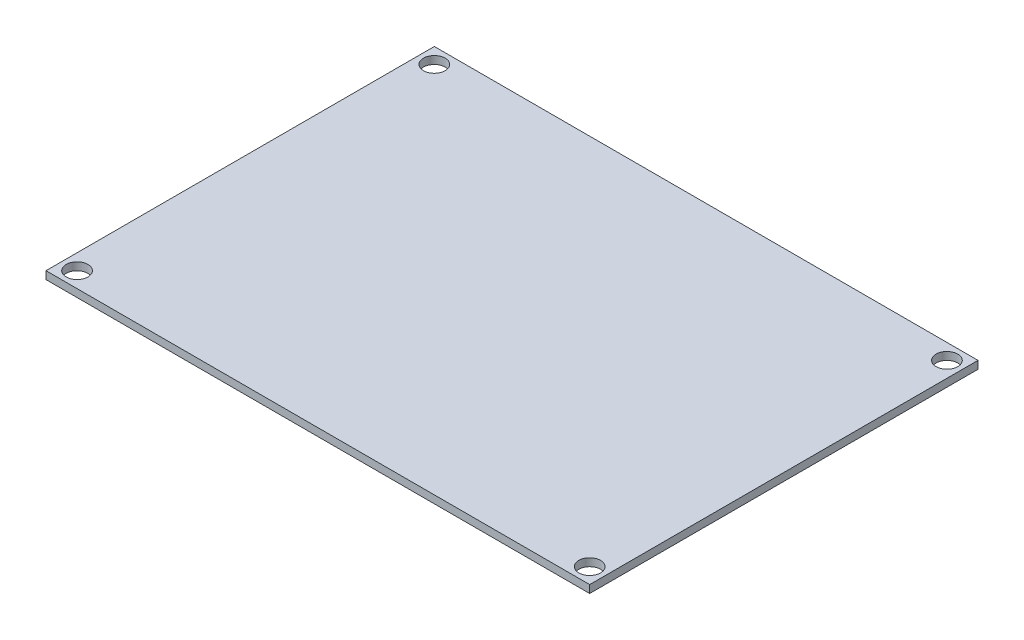
ISO-10303-21;
HEADER;
FILE_DESCRIPTION(('STEP AP214'),'2;1');
FILE_NAME('part.step','',(''),(''),'','','');
FILE_SCHEMA(('AUTOMOTIVE_DESIGN { 1 0 10303 214 1 1 1 1 }'));
ENDSEC;
DATA;
#1=APPLICATION_CONTEXT('core data for automotive mechanical design processes');
#2=APPLICATION_PROTOCOL_DEFINITION('international standard','automotive_design',2000,#1);
#3=PRODUCT_CONTEXT('',#1,'mechanical');
#4=PRODUCT('Part','Part','',(#3));
#5=PRODUCT_RELATED_PRODUCT_CATEGORY('part','',(#4));
#6=PRODUCT_DEFINITION_FORMATION('','',#4);
#7=PRODUCT_DEFINITION_CONTEXT('part definition',#1,'design');
#8=PRODUCT_DEFINITION('design','',#6,#7);
#9=PRODUCT_DEFINITION_SHAPE('','',#8);
#10=(LENGTH_UNIT() NAMED_UNIT(*) SI_UNIT(.MILLI.,.METRE.));
#11=(NAMED_UNIT(*) PLANE_ANGLE_UNIT() SI_UNIT($,.RADIAN.));
#12=(NAMED_UNIT(*) SI_UNIT($,.STERADIAN.) SOLID_ANGLE_UNIT());
#13=UNCERTAINTY_MEASURE_WITH_UNIT(LENGTH_MEASURE(1.E-05),#10,'distance_accuracy_value','');
#14=(GEOMETRIC_REPRESENTATION_CONTEXT(3) GLOBAL_UNCERTAINTY_ASSIGNED_CONTEXT((#13)) GLOBAL_UNIT_ASSIGNED_CONTEXT((#10,
#11,#12)) REPRESENTATION_CONTEXT('',''));
#15=CARTESIAN_POINT('',(0.,0.,0.));
#16=DIRECTION('',(0.,0.,1.));
#17=DIRECTION('',(1.,0.,0.));
#18=AXIS2_PLACEMENT_3D('',#15,#16,#17);
#19=CARTESIAN_POINT('',(0.,1.,0.));
#20=DIRECTION('',(1.,0.,0.));
#21=DIRECTION('',(0.,0.,-1.));
#22=AXIS2_PLACEMENT_3D('',#19,#20,#21);
#23=PLANE('',#22);
#24=DIRECTION('',(0.,0.,1.));
#25=VECTOR('',#24,1.);
#26=CARTESIAN_POINT('',(0.,0.,0.));
#27=LINE('',#26,#25);
#28=CARTESIAN_POINT('',(0.,0.,-50.));
#29=VERTEX_POINT('',#28);
#30=CARTESIAN_POINT('',(0.,0.,0.));
#31=VERTEX_POINT('',#30);
#32=EDGE_CURVE('E96',#29,#31,#27,.T.);
#33=ORIENTED_EDGE('',*,*,#32,.T.);
#34=DIRECTION('',(0.,-1.,0.));
#35=VECTOR('',#34,1.);
#36=CARTESIAN_POINT('',(0.,1.,0.));
#37=LINE('',#36,#35);
#38=CARTESIAN_POINT('',(0.,1.,0.));
#39=VERTEX_POINT('',#38);
#40=EDGE_CURVE('E11',#39,#31,#37,.T.);
#41=ORIENTED_EDGE('',*,*,#40,.F.);
#42=DIRECTION('',(0.,0.,1.));
#43=VECTOR('',#42,1.);
#44=CARTESIAN_POINT('',(0.,1.,0.));
#45=LINE('',#44,#43);
#46=CARTESIAN_POINT('',(0.,1.,-50.));
#47=VERTEX_POINT('',#46);
#48=EDGE_CURVE('E84',#47,#39,#45,.T.);
#49=ORIENTED_EDGE('',*,*,#48,.F.);
#50=DIRECTION('',(0.,-1.,0.));
#51=VECTOR('',#50,1.);
#52=CARTESIAN_POINT('',(0.,1.,-50.));
#53=LINE('',#52,#51);
#54=EDGE_CURVE('E92',#47,#29,#53,.T.);
#55=ORIENTED_EDGE('',*,*,#54,.T.);
#56=EDGE_LOOP('',(#33,#41,#49,#55));
#57=FACE_BOUND('',#56,.T.);
#58=ADVANCED_FACE('F33',(#57),#23,.F.);
#59=CARTESIAN_POINT('',(0.,1.,0.));
#60=DIRECTION('',(0.,0.,-1.));
#61=DIRECTION('',(-1.,0.,0.));
#62=AXIS2_PLACEMENT_3D('',#59,#60,#61);
#63=PLANE('',#62);
#64=DIRECTION('',(1.,0.,0.));
#65=VECTOR('',#64,1.);
#66=CARTESIAN_POINT('',(0.,0.,0.));
#67=LINE('',#66,#65);
#68=CARTESIAN_POINT('',(70.,0.,0.));
#69=VERTEX_POINT('',#68);
#70=EDGE_CURVE('E88',#31,#69,#67,.T.);
#71=ORIENTED_EDGE('',*,*,#70,.T.);
#72=DIRECTION('',(0.,-1.,0.));
#73=VECTOR('',#72,1.);
#74=CARTESIAN_POINT('',(70.,1.,0.));
#75=LINE('',#74,#73);
#76=CARTESIAN_POINT('',(70.,1.,0.));
#77=VERTEX_POINT('',#76);
#78=EDGE_CURVE('E41',#77,#69,#75,.T.);
#79=ORIENTED_EDGE('',*,*,#78,.F.);
#80=DIRECTION('',(1.,0.,0.));
#81=VECTOR('',#80,1.);
#82=CARTESIAN_POINT('',(0.,1.,0.));
#83=LINE('',#82,#81);
#84=EDGE_CURVE('E79',#39,#77,#83,.T.);
#85=ORIENTED_EDGE('',*,*,#84,.F.);
#86=ORIENTED_EDGE('',*,*,#40,.T.);
#87=EDGE_LOOP('',(#71,#79,#85,#86));
#88=FACE_BOUND('',#87,.T.);
#89=ADVANCED_FACE('F87',(#88),#63,.F.);
#90=CARTESIAN_POINT('',(70.,1.,0.));
#91=DIRECTION('',(-1.,0.,0.));
#92=DIRECTION('',(0.,0.,1.));
#93=AXIS2_PLACEMENT_3D('',#90,#91,#92);
#94=PLANE('',#93);
#95=DIRECTION('',(0.,0.,-1.));
#96=VECTOR('',#95,1.);
#97=CARTESIAN_POINT('',(70.,0.,0.));
#98=LINE('',#97,#96);
#99=CARTESIAN_POINT('',(70.,0.,-50.));
#100=VERTEX_POINT('',#99);
#101=EDGE_CURVE('E66',#69,#100,#98,.T.);
#102=ORIENTED_EDGE('',*,*,#101,.T.);
#103=DIRECTION('',(0.,-1.,0.));
#104=VECTOR('',#103,1.);
#105=CARTESIAN_POINT('',(70.,1.,-50.));
#106=LINE('',#105,#104);
#107=CARTESIAN_POINT('',(70.,1.,-50.));
#108=VERTEX_POINT('',#107);
#109=EDGE_CURVE('E89',#108,#100,#106,.T.);
#110=ORIENTED_EDGE('',*,*,#109,.F.);
#111=DIRECTION('',(0.,0.,-1.));
#112=VECTOR('',#111,1.);
#113=CARTESIAN_POINT('',(70.,1.,0.));
#114=LINE('',#113,#112);
#115=EDGE_CURVE('E82',#77,#108,#114,.T.);
#116=ORIENTED_EDGE('',*,*,#115,.F.);
#117=ORIENTED_EDGE('',*,*,#78,.T.);
#118=EDGE_LOOP('',(#102,#110,#116,#117));
#119=FACE_BOUND('',#118,.T.);
#120=ADVANCED_FACE('F90',(#119),#94,.F.);
#121=CARTESIAN_POINT('',(0.,1.,-50.));
#122=DIRECTION('',(0.,0.,1.));
#123=DIRECTION('',(1.,0.,0.));
#124=AXIS2_PLACEMENT_3D('',#121,#122,#123);
#125=PLANE('',#124);
#126=DIRECTION('',(-1.,0.,0.));
#127=VECTOR('',#126,1.);
#128=CARTESIAN_POINT('',(0.,0.,-50.));
#129=LINE('',#128,#127);
#130=EDGE_CURVE('E72',#100,#29,#129,.T.);
#131=ORIENTED_EDGE('',*,*,#130,.T.);
#132=ORIENTED_EDGE('',*,*,#54,.F.);
#133=DIRECTION('',(-1.,0.,0.));
#134=VECTOR('',#133,1.);
#135=CARTESIAN_POINT('',(0.,1.,-50.));
#136=LINE('',#135,#134);
#137=EDGE_CURVE('E49',#108,#47,#136,.T.);
#138=ORIENTED_EDGE('',*,*,#137,.F.);
#139=ORIENTED_EDGE('',*,*,#109,.T.);
#140=EDGE_LOOP('',(#131,#132,#138,#139));
#141=FACE_BOUND('',#140,.T.);
#142=ADVANCED_FACE('F104',(#141),#125,.F.);
#143=CARTESIAN_POINT('',(0.,1.,0.));
#144=DIRECTION('',(0.,-1.,0.));
#145=DIRECTION('',(0.,0.,-1.));
#146=AXIS2_PLACEMENT_3D('',#143,#144,#145);
#147=PLANE('',#146);
#148=CARTESIAN_POINT('',(2.00000000000001,1.,-2.00000000000001));
#149=DIRECTION('',(0.,1.,0.));
#150=DIRECTION('',(0.,0.,1.));
#151=AXIS2_PLACEMENT_3D('',#148,#149,#150);
#152=CIRCLE('',#151,1.4);
#153=CARTESIAN_POINT('',(2.00000000000001,1.,-0.600000000000009));
#154=VERTEX_POINT('',#153);
#155=EDGE_CURVE('E116',#154,#154,#152,.T.);
#156=ORIENTED_EDGE('',*,*,#155,.F.);
#157=EDGE_LOOP('',(#156));
#158=FACE_BOUND('',#157,.T.);
#159=CARTESIAN_POINT('',(68.,1.,-2.00000000000001));
#160=DIRECTION('',(0.,1.,0.));
#161=DIRECTION('',(0.,0.,1.));
#162=AXIS2_PLACEMENT_3D('',#159,#160,#161);
#163=CIRCLE('',#162,1.4);
#164=CARTESIAN_POINT('',(68.,1.,-0.600000000000006));
#165=VERTEX_POINT('',#164);
#166=EDGE_CURVE('E122',#165,#165,#163,.T.);
#167=ORIENTED_EDGE('',*,*,#166,.F.);
#168=EDGE_LOOP('',(#167));
#169=FACE_BOUND('',#168,.T.);
#170=CARTESIAN_POINT('',(68.,1.,-48.));
#171=DIRECTION('',(0.,1.,0.));
#172=DIRECTION('',(0.,0.,1.));
#173=AXIS2_PLACEMENT_3D('',#170,#171,#172);
#174=CIRCLE('',#173,1.4);
#175=CARTESIAN_POINT('',(68.,1.,-46.6));
#176=VERTEX_POINT('',#175);
#177=EDGE_CURVE('E128',#176,#176,#174,.T.);
#178=ORIENTED_EDGE('',*,*,#177,.F.);
#179=EDGE_LOOP('',(#178));
#180=FACE_BOUND('',#179,.T.);
#181=CARTESIAN_POINT('',(2.00000000000002,1.,-48.));
#182=DIRECTION('',(0.,1.,0.));
#183=DIRECTION('',(0.,0.,1.));
#184=AXIS2_PLACEMENT_3D('',#181,#182,#183);
#185=CIRCLE('',#184,1.4);
#186=CARTESIAN_POINT('',(2.00000000000002,1.,-46.6));
#187=VERTEX_POINT('',#186);
#188=EDGE_CURVE('E110',#187,#187,#185,.T.);
#189=ORIENTED_EDGE('',*,*,#188,.F.);
#190=EDGE_LOOP('',(#189));
#191=FACE_BOUND('',#190,.T.);
#192=ORIENTED_EDGE('',*,*,#48,.T.);
#193=ORIENTED_EDGE('',*,*,#84,.T.);
#194=ORIENTED_EDGE('',*,*,#115,.T.);
#195=ORIENTED_EDGE('',*,*,#137,.T.);
#196=EDGE_LOOP('',(#192,#193,#194,#195));
#197=FACE_BOUND('',#196,.T.);
#198=ADVANCED_FACE('F80',(#158,#169,#180,#191,#197),#147,.F.);
#199=CARTESIAN_POINT('',(0.,0.,0.));
#200=DIRECTION('',(0.,-1.,0.));
#201=DIRECTION('',(0.,0.,-1.));
#202=AXIS2_PLACEMENT_3D('',#199,#200,#201);
#203=PLANE('',#202);
#204=CARTESIAN_POINT('',(2.00000000000001,0.,-2.00000000000001));
#205=DIRECTION('',(0.,1.,0.));
#206=DIRECTION('',(0.,0.,1.));
#207=AXIS2_PLACEMENT_3D('',#204,#205,#206);
#208=CIRCLE('',#207,1.4);
#209=CARTESIAN_POINT('',(2.00000000000001,0.,-0.600000000000009));
#210=VERTEX_POINT('',#209);
#211=EDGE_CURVE('E119',#210,#210,#208,.T.);
#212=ORIENTED_EDGE('',*,*,#211,.T.);
#213=EDGE_LOOP('',(#212));
#214=FACE_BOUND('',#213,.T.);
#215=CARTESIAN_POINT('',(68.,0.,-2.00000000000001));
#216=DIRECTION('',(0.,1.,0.));
#217=DIRECTION('',(0.,0.,1.));
#218=AXIS2_PLACEMENT_3D('',#215,#216,#217);
#219=CIRCLE('',#218,1.4);
#220=CARTESIAN_POINT('',(68.,0.,-0.600000000000006));
#221=VERTEX_POINT('',#220);
#222=EDGE_CURVE('E125',#221,#221,#219,.T.);
#223=ORIENTED_EDGE('',*,*,#222,.T.);
#224=EDGE_LOOP('',(#223));
#225=FACE_BOUND('',#224,.T.);
#226=CARTESIAN_POINT('',(68.,0.,-48.));
#227=DIRECTION('',(0.,1.,0.));
#228=DIRECTION('',(0.,0.,1.));
#229=AXIS2_PLACEMENT_3D('',#226,#227,#228);
#230=CIRCLE('',#229,1.4);
#231=CARTESIAN_POINT('',(68.,0.,-46.6));
#232=VERTEX_POINT('',#231);
#233=EDGE_CURVE('E113',#232,#232,#230,.T.);
#234=ORIENTED_EDGE('',*,*,#233,.T.);
#235=EDGE_LOOP('',(#234));
#236=FACE_BOUND('',#235,.T.);
#237=CARTESIAN_POINT('',(2.00000000000002,0.,-48.));
#238=DIRECTION('',(0.,1.,0.));
#239=DIRECTION('',(0.,0.,1.));
#240=AXIS2_PLACEMENT_3D('',#237,#238,#239);
#241=CIRCLE('',#240,1.4);
#242=CARTESIAN_POINT('',(2.00000000000002,0.,-46.6));
#243=VERTEX_POINT('',#242);
#244=EDGE_CURVE('E99',#243,#243,#241,.T.);
#245=ORIENTED_EDGE('',*,*,#244,.T.);
#246=EDGE_LOOP('',(#245));
#247=FACE_BOUND('',#246,.T.);
#248=ORIENTED_EDGE('',*,*,#32,.F.);
#249=ORIENTED_EDGE('',*,*,#130,.F.);
#250=ORIENTED_EDGE('',*,*,#101,.F.);
#251=ORIENTED_EDGE('',*,*,#70,.F.);
#252=EDGE_LOOP('',(#248,#249,#250,#251));
#253=FACE_BOUND('',#252,.T.);
#254=ADVANCED_FACE('F107',(#214,#225,#236,#247,#253),#203,.T.);
#255=CARTESIAN_POINT('',(2.00000000000002,0.,-48.));
#256=DIRECTION('',(0.,1.,0.));
#257=DIRECTION('',(0.,0.,1.));
#258=AXIS2_PLACEMENT_3D('',#255,#256,#257);
#259=CYLINDRICAL_SURFACE('',#258,1.4);
#260=ORIENTED_EDGE('',*,*,#244,.F.);
#261=EDGE_LOOP('',(#260));
#262=FACE_BOUND('',#261,.T.);
#263=ORIENTED_EDGE('',*,*,#188,.T.);
#264=EDGE_LOOP('',(#263));
#265=FACE_BOUND('',#264,.T.);
#266=ADVANCED_FACE('F140',(#262,#265),#259,.F.);
#267=CARTESIAN_POINT('',(68.,0.,-48.));
#268=DIRECTION('',(0.,1.,0.));
#269=DIRECTION('',(0.,0.,1.));
#270=AXIS2_PLACEMENT_3D('',#267,#268,#269);
#271=CYLINDRICAL_SURFACE('',#270,1.4);
#272=ORIENTED_EDGE('',*,*,#233,.F.);
#273=EDGE_LOOP('',(#272));
#274=FACE_BOUND('',#273,.T.);
#275=ORIENTED_EDGE('',*,*,#177,.T.);
#276=EDGE_LOOP('',(#275));
#277=FACE_BOUND('',#276,.T.);
#278=ADVANCED_FACE('F136',(#274,#277),#271,.F.);
#279=CARTESIAN_POINT('',(68.,0.,-2.00000000000001));
#280=DIRECTION('',(0.,1.,0.));
#281=DIRECTION('',(0.,0.,1.));
#282=AXIS2_PLACEMENT_3D('',#279,#280,#281);
#283=CYLINDRICAL_SURFACE('',#282,1.4);
#284=ORIENTED_EDGE('',*,*,#222,.F.);
#285=EDGE_LOOP('',(#284));
#286=FACE_BOUND('',#285,.T.);
#287=ORIENTED_EDGE('',*,*,#166,.T.);
#288=EDGE_LOOP('',(#287));
#289=FACE_BOUND('',#288,.T.);
#290=ADVANCED_FACE('F139',(#286,#289),#283,.F.);
#291=CARTESIAN_POINT('',(2.00000000000001,0.,-2.00000000000001));
#292=DIRECTION('',(0.,1.,0.));
#293=DIRECTION('',(0.,0.,1.));
#294=AXIS2_PLACEMENT_3D('',#291,#292,#293);
#295=CYLINDRICAL_SURFACE('',#294,1.4);
#296=ORIENTED_EDGE('',*,*,#211,.F.);
#297=EDGE_LOOP('',(#296));
#298=FACE_BOUND('',#297,.T.);
#299=ORIENTED_EDGE('',*,*,#155,.T.);
#300=EDGE_LOOP('',(#299));
#301=FACE_BOUND('',#300,.T.);
#302=ADVANCED_FACE('F201',(#298,#301),#295,.F.);
#303=CLOSED_SHELL('',(#58,#89,#120,#142,#198,#254,#266,#278,#290,#302));
#304=MANIFOLD_SOLID_BREP('B2',#303);
#305=ADVANCED_BREP_SHAPE_REPRESENTATION('',(#18,#304),#14);
#306=SHAPE_DEFINITION_REPRESENTATION(#9,#305);
ENDSEC;
END-ISO-10303-21;
